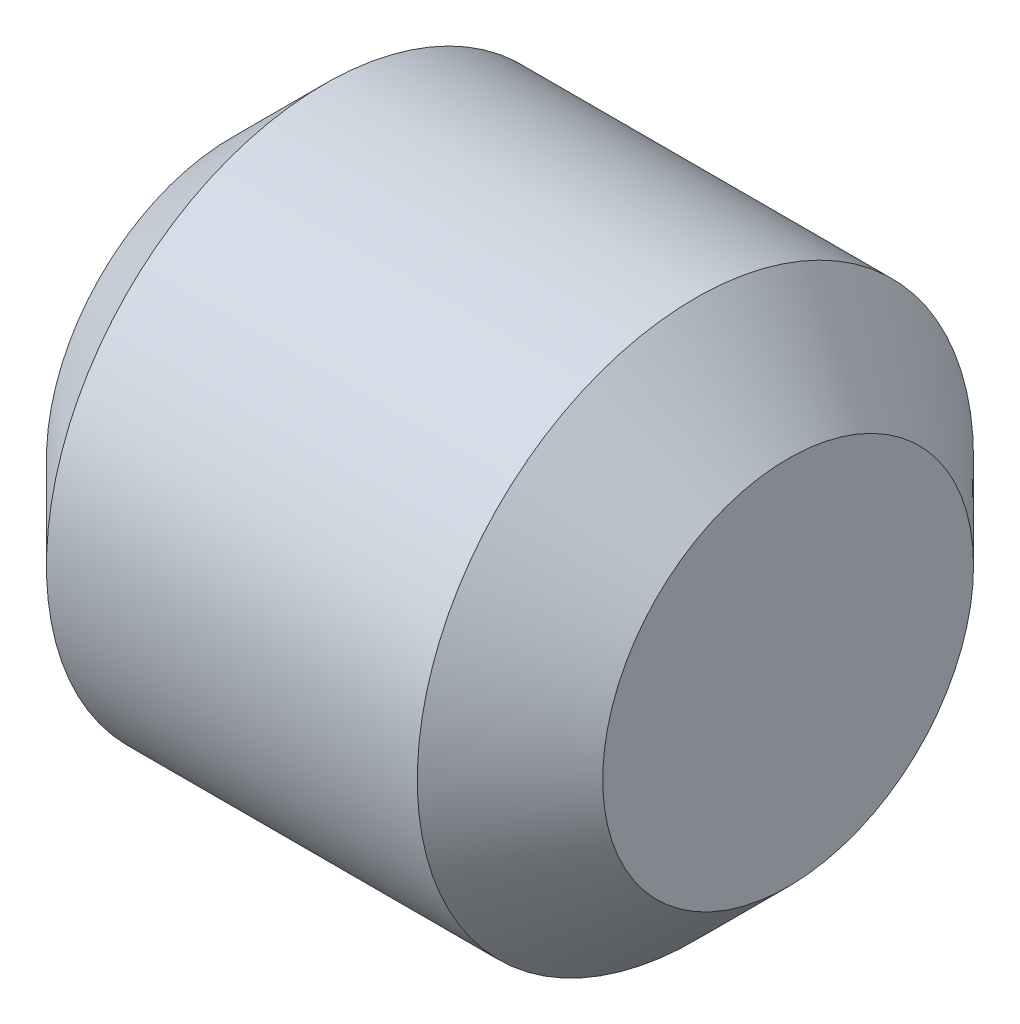
ISO-10303-21;
HEADER;
FILE_DESCRIPTION(('STEP AP214'),'2;1');
FILE_NAME('part.step','',(''),(''),'','','');
FILE_SCHEMA(('AUTOMOTIVE_DESIGN { 1 0 10303 214 1 1 1 1 }'));
ENDSEC;
DATA;
#1=APPLICATION_CONTEXT('core data for automotive mechanical design processes');
#2=APPLICATION_PROTOCOL_DEFINITION('international standard','automotive_design',2000,#1);
#3=PRODUCT_CONTEXT('',#1,'mechanical');
#4=PRODUCT('Part','Part','',(#3));
#5=PRODUCT_RELATED_PRODUCT_CATEGORY('part','',(#4));
#6=PRODUCT_DEFINITION_FORMATION('','',#4);
#7=PRODUCT_DEFINITION_CONTEXT('part definition',#1,'design');
#8=PRODUCT_DEFINITION('design','',#6,#7);
#9=PRODUCT_DEFINITION_SHAPE('','',#8);
#10=(LENGTH_UNIT() NAMED_UNIT(*) SI_UNIT(.MILLI.,.METRE.));
#11=(NAMED_UNIT(*) PLANE_ANGLE_UNIT() SI_UNIT($,.RADIAN.));
#12=(NAMED_UNIT(*) SI_UNIT($,.STERADIAN.) SOLID_ANGLE_UNIT());
#13=UNCERTAINTY_MEASURE_WITH_UNIT(LENGTH_MEASURE(1.E-05),#10,'distance_accuracy_value','');
#14=(GEOMETRIC_REPRESENTATION_CONTEXT(3) GLOBAL_UNCERTAINTY_ASSIGNED_CONTEXT((#13)) GLOBAL_UNIT_ASSIGNED_CONTEXT((#10,
#11,#12)) REPRESENTATION_CONTEXT('',''));
#15=CARTESIAN_POINT('',(0.,0.,0.));
#16=DIRECTION('',(0.,0.,1.));
#17=DIRECTION('',(1.,0.,0.));
#18=AXIS2_PLACEMENT_3D('',#15,#16,#17);
#19=CARTESIAN_POINT('',(400.,0.,0.));
#20=DIRECTION('',(-1.,0.,0.));
#21=DIRECTION('',(0.,0.,1.));
#22=AXIS2_PLACEMENT_3D('',#19,#20,#21);
#23=CYLINDRICAL_SURFACE('',#22,300.);
#24=CARTESIAN_POINT('',(400.,0.,0.));
#25=DIRECTION('',(1.,0.,0.));
#26=DIRECTION('',(0.,0.,-1.));
#27=AXIS2_PLACEMENT_3D('',#24,#25,#26);
#28=CIRCLE('',#27,300.);
#29=CARTESIAN_POINT('',(400.,0.,-300.));
#30=VERTEX_POINT('',#29);
#31=EDGE_CURVE('E10',#30,#30,#28,.T.);
#32=ORIENTED_EDGE('',*,*,#31,.F.);
#33=EDGE_LOOP('',(#32));
#34=FACE_BOUND('',#33,.T.);
#35=CARTESIAN_POINT('',(0.,0.,0.));
#36=DIRECTION('',(1.,0.,0.));
#37=DIRECTION('',(0.,0.,-1.));
#38=AXIS2_PLACEMENT_3D('',#35,#36,#37);
#39=CIRCLE('',#38,300.);
#40=CARTESIAN_POINT('',(0.,0.,-300.));
#41=VERTEX_POINT('',#40);
#42=EDGE_CURVE('E43',#41,#41,#39,.T.);
#43=ORIENTED_EDGE('',*,*,#42,.T.);
#44=EDGE_LOOP('',(#43));
#45=FACE_BOUND('',#44,.T.);
#46=ADVANCED_FACE('F33',(#34,#45),#23,.T.);
#47=CARTESIAN_POINT('',(0.,0.,0.));
#48=DIRECTION('',(1.,0.,0.));
#49=DIRECTION('',(0.,0.,-1.));
#50=AXIS2_PLACEMENT_3D('',#47,#48,#49);
#51=CONICAL_SURFACE('',#50,300.,0.785398163397449);
#52=CARTESIAN_POINT('',(-100.,0.,0.));
#53=DIRECTION('',(1.,0.,0.));
#54=DIRECTION('',(0.,0.,-1.));
#55=AXIS2_PLACEMENT_3D('',#52,#53,#54);
#56=CIRCLE('',#55,200.);
#57=CARTESIAN_POINT('',(-100.,0.,-200.));
#58=VERTEX_POINT('',#57);
#59=EDGE_CURVE('E39',#58,#58,#56,.T.);
#60=ORIENTED_EDGE('',*,*,#59,.T.);
#61=EDGE_LOOP('',(#60));
#62=FACE_BOUND('',#61,.T.);
#63=ORIENTED_EDGE('',*,*,#42,.F.);
#64=EDGE_LOOP('',(#63));
#65=FACE_BOUND('',#64,.T.);
#66=ADVANCED_FACE('F64',(#62,#65),#51,.T.);
#67=CARTESIAN_POINT('',(-100.,0.,0.));
#68=DIRECTION('',(1.,0.,0.));
#69=DIRECTION('',(0.,0.,-1.));
#70=AXIS2_PLACEMENT_3D('',#67,#68,#69);
#71=PLANE('',#70);
#72=ORIENTED_EDGE('',*,*,#59,.F.);
#73=EDGE_LOOP('',(#72));
#74=FACE_BOUND('',#73,.T.);
#75=ADVANCED_FACE('F57',(#74),#71,.F.);
#76=CARTESIAN_POINT('',(400.,0.,0.));
#77=DIRECTION('',(-1.,0.,0.));
#78=DIRECTION('',(0.,0.,-1.));
#79=AXIS2_PLACEMENT_3D('',#76,#77,#78);
#80=CONICAL_SURFACE('',#79,300.,0.785398163397449);
#81=CARTESIAN_POINT('',(500.,0.,0.));
#82=DIRECTION('',(1.,0.,0.));
#83=DIRECTION('',(0.,0.,-1.));
#84=AXIS2_PLACEMENT_3D('',#81,#82,#83);
#85=CIRCLE('',#84,200.);
#86=CARTESIAN_POINT('',(500.,0.,-200.));
#87=VERTEX_POINT('',#86);
#88=EDGE_CURVE('E47',#87,#87,#85,.T.);
#89=ORIENTED_EDGE('',*,*,#88,.F.);
#90=EDGE_LOOP('',(#89));
#91=FACE_BOUND('',#90,.T.);
#92=ORIENTED_EDGE('',*,*,#31,.T.);
#93=EDGE_LOOP('',(#92));
#94=FACE_BOUND('',#93,.T.);
#95=ADVANCED_FACE('F55',(#91,#94),#80,.T.);
#96=CARTESIAN_POINT('',(500.,0.,0.));
#97=DIRECTION('',(1.,0.,0.));
#98=DIRECTION('',(0.,0.,-1.));
#99=AXIS2_PLACEMENT_3D('',#96,#97,#98);
#100=PLANE('',#99);
#101=ORIENTED_EDGE('',*,*,#88,.T.);
#102=EDGE_LOOP('',(#101));
#103=FACE_BOUND('',#102,.T.);
#104=ADVANCED_FACE('F53',(#103),#100,.T.);
#105=CLOSED_SHELL('',(#46,#66,#75,#95,#104));
#106=MANIFOLD_SOLID_BREP('B2',#105);
#107=ADVANCED_BREP_SHAPE_REPRESENTATION('',(#18,#106),#14);
#108=SHAPE_DEFINITION_REPRESENTATION(#9,#107);
ENDSEC;
END-ISO-10303-21;
